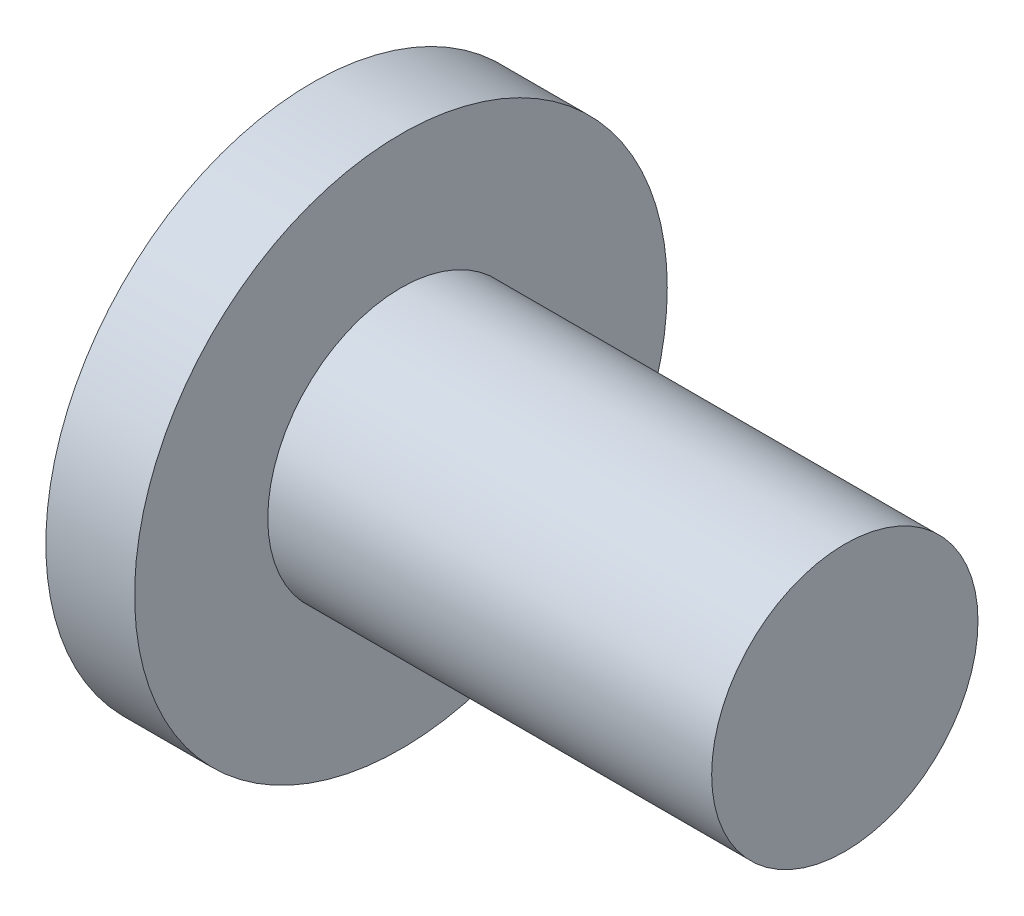
ISO-10303-21;
HEADER;
FILE_DESCRIPTION(('STEP AP214'),'2;1');
FILE_NAME('part.step','',(''),(''),'','','');
FILE_SCHEMA(('AUTOMOTIVE_DESIGN { 1 0 10303 214 1 1 1 1 }'));
ENDSEC;
DATA;
#1=APPLICATION_CONTEXT('core data for automotive mechanical design processes');
#2=APPLICATION_PROTOCOL_DEFINITION('international standard','automotive_design',2000,#1);
#3=PRODUCT_CONTEXT('',#1,'mechanical');
#4=PRODUCT('Part','Part','',(#3));
#5=PRODUCT_RELATED_PRODUCT_CATEGORY('part','',(#4));
#6=PRODUCT_DEFINITION_FORMATION('','',#4);
#7=PRODUCT_DEFINITION_CONTEXT('part definition',#1,'design');
#8=PRODUCT_DEFINITION('design','',#6,#7);
#9=PRODUCT_DEFINITION_SHAPE('','',#8);
#10=(LENGTH_UNIT() NAMED_UNIT(*) SI_UNIT(.MILLI.,.METRE.));
#11=(NAMED_UNIT(*) PLANE_ANGLE_UNIT() SI_UNIT($,.RADIAN.));
#12=(NAMED_UNIT(*) SI_UNIT($,.STERADIAN.) SOLID_ANGLE_UNIT());
#13=UNCERTAINTY_MEASURE_WITH_UNIT(LENGTH_MEASURE(1.E-05),#10,'distance_accuracy_value','');
#14=(GEOMETRIC_REPRESENTATION_CONTEXT(3) GLOBAL_UNCERTAINTY_ASSIGNED_CONTEXT((#13)) GLOBAL_UNIT_ASSIGNED_CONTEXT((#10,
#11,#12)) REPRESENTATION_CONTEXT('',''));
#15=CARTESIAN_POINT('',(0.,0.,0.));
#16=DIRECTION('',(0.,0.,1.));
#17=DIRECTION('',(1.,0.,0.));
#18=AXIS2_PLACEMENT_3D('',#15,#16,#17);
#19=CARTESIAN_POINT('',(0.,0.,-76.2));
#20=DIRECTION('',(1.,0.,0.));
#21=DIRECTION('',(0.,0.,-1.));
#22=AXIS2_PLACEMENT_3D('',#19,#20,#21);
#23=PLANE('',#22);
#24=CARTESIAN_POINT('',(0.,0.,0.));
#25=DIRECTION('',(1.,0.,0.));
#26=DIRECTION('',(0.,0.,-1.));
#27=AXIS2_PLACEMENT_3D('',#24,#25,#26);
#28=CIRCLE('',#27,76.2);
#29=CARTESIAN_POINT('',(0.,0.,-76.2));
#30=VERTEX_POINT('',#29);
#31=EDGE_CURVE('E54',#30,#30,#28,.T.);
#32=ORIENTED_EDGE('',*,*,#31,.T.);
#33=EDGE_LOOP('',(#32));
#34=FACE_BOUND('',#33,.T.);
#35=ADVANCED_FACE('F37',(#34),#23,.T.);
#36=CARTESIAN_POINT('',(-304.8,0.,0.));
#37=DIRECTION('',(-1.,0.,0.));
#38=DIRECTION('',(0.,0.,1.));
#39=AXIS2_PLACEMENT_3D('',#36,#37,#38);
#40=PLANE('',#39);
#41=CARTESIAN_POINT('',(-304.8,0.,0.));
#42=DIRECTION('',(1.,0.,0.));
#43=DIRECTION('',(0.,0.,-1.));
#44=AXIS2_PLACEMENT_3D('',#41,#42,#43);
#45=CIRCLE('',#44,152.4);
#46=CARTESIAN_POINT('',(-304.8,0.,-152.4));
#47=VERTEX_POINT('',#46);
#48=EDGE_CURVE('E10',#47,#47,#45,.T.);
#49=ORIENTED_EDGE('',*,*,#48,.F.);
#50=EDGE_LOOP('',(#49));
#51=FACE_BOUND('',#50,.T.);
#52=ADVANCED_FACE('F73',(#51),#40,.T.);
#53=CARTESIAN_POINT('',(0.,0.,0.));
#54=DIRECTION('',(1.,0.,0.));
#55=DIRECTION('',(0.,0.,-1.));
#56=AXIS2_PLACEMENT_3D('',#53,#54,#55);
#57=CYLINDRICAL_SURFACE('',#56,152.4);
#58=ORIENTED_EDGE('',*,*,#48,.T.);
#59=EDGE_LOOP('',(#58));
#60=FACE_BOUND('',#59,.T.);
#61=CARTESIAN_POINT('',(-254.,0.,0.));
#62=DIRECTION('',(1.,0.,0.));
#63=DIRECTION('',(0.,0.,-1.));
#64=AXIS2_PLACEMENT_3D('',#61,#62,#63);
#65=CIRCLE('',#64,152.4);
#66=CARTESIAN_POINT('',(-254.,0.,-152.4));
#67=VERTEX_POINT('',#66);
#68=EDGE_CURVE('E44',#67,#67,#65,.T.);
#69=ORIENTED_EDGE('',*,*,#68,.F.);
#70=EDGE_LOOP('',(#69));
#71=FACE_BOUND('',#70,.T.);
#72=ADVANCED_FACE('F70',(#60,#71),#57,.T.);
#73=CARTESIAN_POINT('',(-254.,0.,-152.4));
#74=DIRECTION('',(1.,0.,0.));
#75=DIRECTION('',(0.,0.,-1.));
#76=AXIS2_PLACEMENT_3D('',#73,#74,#75);
#77=PLANE('',#76);
#78=ORIENTED_EDGE('',*,*,#68,.T.);
#79=EDGE_LOOP('',(#78));
#80=FACE_BOUND('',#79,.T.);
#81=CARTESIAN_POINT('',(-254.,0.,0.));
#82=DIRECTION('',(1.,0.,0.));
#83=DIRECTION('',(0.,0.,-1.));
#84=AXIS2_PLACEMENT_3D('',#81,#82,#83);
#85=CIRCLE('',#84,76.2);
#86=CARTESIAN_POINT('',(-254.,0.,-76.2));
#87=VERTEX_POINT('',#86);
#88=EDGE_CURVE('E49',#87,#87,#85,.T.);
#89=ORIENTED_EDGE('',*,*,#88,.F.);
#90=EDGE_LOOP('',(#89));
#91=FACE_BOUND('',#90,.T.);
#92=ADVANCED_FACE('F64',(#80,#91),#77,.T.);
#93=CARTESIAN_POINT('',(0.,0.,0.));
#94=DIRECTION('',(1.,0.,0.));
#95=DIRECTION('',(0.,0.,-1.));
#96=AXIS2_PLACEMENT_3D('',#93,#94,#95);
#97=CYLINDRICAL_SURFACE('',#96,76.2);
#98=ORIENTED_EDGE('',*,*,#88,.T.);
#99=EDGE_LOOP('',(#98));
#100=FACE_BOUND('',#99,.T.);
#101=ORIENTED_EDGE('',*,*,#31,.F.);
#102=EDGE_LOOP('',(#101));
#103=FACE_BOUND('',#102,.T.);
#104=ADVANCED_FACE('F62',(#100,#103),#97,.T.);
#105=CLOSED_SHELL('',(#35,#52,#72,#92,#104));
#106=MANIFOLD_SOLID_BREP('B2',#105);
#107=ADVANCED_BREP_SHAPE_REPRESENTATION('',(#18,#106),#14);
#108=SHAPE_DEFINITION_REPRESENTATION(#9,#107);
ENDSEC;
END-ISO-10303-21;
